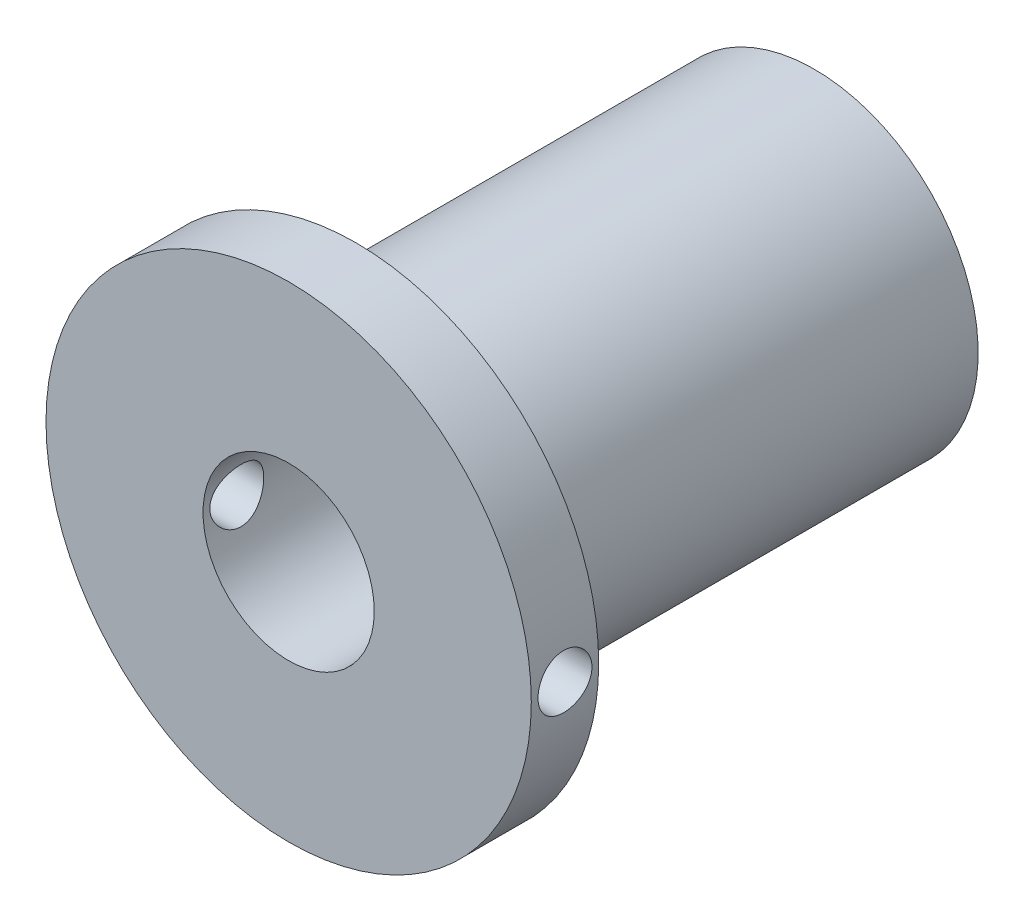
ISO-10303-21;
HEADER;
FILE_DESCRIPTION(('STEP AP214'),'2;1');
FILE_NAME('part.step','',(''),(''),'','','');
FILE_SCHEMA(('AUTOMOTIVE_DESIGN { 1 0 10303 214 1 1 1 1 }'));
ENDSEC;
DATA;
#1=APPLICATION_CONTEXT('core data for automotive mechanical design processes');
#2=APPLICATION_PROTOCOL_DEFINITION('international standard','automotive_design',2000,#1);
#3=PRODUCT_CONTEXT('',#1,'mechanical');
#4=PRODUCT('Part','Part','',(#3));
#5=PRODUCT_RELATED_PRODUCT_CATEGORY('part','',(#4));
#6=PRODUCT_DEFINITION_FORMATION('','',#4);
#7=PRODUCT_DEFINITION_CONTEXT('part definition',#1,'design');
#8=PRODUCT_DEFINITION('design','',#6,#7);
#9=PRODUCT_DEFINITION_SHAPE('','',#8);
#10=(LENGTH_UNIT() NAMED_UNIT(*) SI_UNIT(.MILLI.,.METRE.));
#11=(NAMED_UNIT(*) PLANE_ANGLE_UNIT() SI_UNIT($,.RADIAN.));
#12=(NAMED_UNIT(*) SI_UNIT($,.STERADIAN.) SOLID_ANGLE_UNIT());
#13=UNCERTAINTY_MEASURE_WITH_UNIT(LENGTH_MEASURE(1.E-05),#10,'distance_accuracy_value','');
#14=(GEOMETRIC_REPRESENTATION_CONTEXT(3) GLOBAL_UNCERTAINTY_ASSIGNED_CONTEXT((#13)) GLOBAL_UNIT_ASSIGNED_CONTEXT((#10,
#11,#12)) REPRESENTATION_CONTEXT('',''));
#15=CARTESIAN_POINT('',(0.,0.,0.));
#16=DIRECTION('',(0.,0.,1.));
#17=DIRECTION('',(1.,0.,0.));
#18=AXIS2_PLACEMENT_3D('',#15,#16,#17);
#19=CARTESIAN_POINT('',(0.,0.,-33.));
#20=DIRECTION('',(0.,0.,1.));
#21=DIRECTION('',(1.,0.,0.));
#22=AXIS2_PLACEMENT_3D('',#19,#20,#21);
#23=PLANE('',#22);
#24=CARTESIAN_POINT('',(0.,0.,-33.));
#25=DIRECTION('',(0.,0.,1.));
#26=DIRECTION('',(1.,0.,0.));
#27=AXIS2_PLACEMENT_3D('',#24,#25,#26);
#28=CIRCLE('',#27,6.35);
#29=CARTESIAN_POINT('',(6.35,0.,-33.));
#30=VERTEX_POINT('',#29);
#31=EDGE_CURVE('E12',#30,#30,#28,.T.);
#32=ORIENTED_EDGE('',*,*,#31,.T.);
#33=EDGE_LOOP('',(#32));
#34=FACE_BOUND('',#33,.T.);
#35=CARTESIAN_POINT('',(0.,0.,-33.));
#36=DIRECTION('',(0.,0.,-1.));
#37=DIRECTION('',(-1.,0.,0.));
#38=AXIS2_PLACEMENT_3D('',#35,#36,#37);
#39=CIRCLE('',#38,12.15);
#40=CARTESIAN_POINT('',(-12.15,0.,-33.));
#41=VERTEX_POINT('',#40);
#42=EDGE_CURVE('E116',#41,#41,#39,.T.);
#43=ORIENTED_EDGE('',*,*,#42,.T.);
#44=EDGE_LOOP('',(#43));
#45=FACE_BOUND('',#44,.T.);
#46=ADVANCED_FACE('F63',(#34,#45),#23,.F.);
#47=CARTESIAN_POINT('',(0.,0.,-33.));
#48=DIRECTION('',(0.,0.,1.));
#49=DIRECTION('',(1.,0.,0.));
#50=AXIS2_PLACEMENT_3D('',#47,#48,#49);
#51=CYLINDRICAL_SURFACE('',#50,18.);
#52=CARTESIAN_POINT('',(0.,0.,1.));
#53=DIRECTION('',(0.,0.,1.));
#54=DIRECTION('',(1.,0.,0.));
#55=AXIS2_PLACEMENT_3D('',#52,#53,#54);
#56=CIRCLE('',#55,18.);
#57=CARTESIAN_POINT('',(18.,0.,1.));
#58=VERTEX_POINT('',#57);
#59=EDGE_CURVE('E67',#58,#58,#56,.F.);
#60=ORIENTED_EDGE('',*,*,#59,.F.);
#61=EDGE_LOOP('',(#60));
#62=FACE_BOUND('',#61,.T.);
#63=CARTESIAN_POINT('',(0.,0.,6.));
#64=DIRECTION('',(0.,0.,1.));
#65=DIRECTION('',(1.,0.,0.));
#66=AXIS2_PLACEMENT_3D('',#63,#64,#65);
#67=CIRCLE('',#66,18.);
#68=CARTESIAN_POINT('',(18.,0.,6.));
#69=VERTEX_POINT('',#68);
#70=EDGE_CURVE('E71',#69,#69,#67,.T.);
#71=ORIENTED_EDGE('',*,*,#70,.F.);
#72=EDGE_LOOP('',(#71));
#73=FACE_BOUND('',#72,.T.);
#74=CARTESIAN_POINT('',(-18.,0.,1.5));
#75=CARTESIAN_POINT('',(-17.9999985855436,-0.111970632349519,1.50000481282726));
#76=CARTESIAN_POINT('',(-17.9989441411048,-0.22401360296951,1.50943474510488));
#77=CARTESIAN_POINT('',(-17.9948391595619,-0.444988473846702,1.54690752842418));
#78=CARTESIAN_POINT('',(-17.9917864712715,-0.553916889117786,1.57497043905084));
#79=CARTESIAN_POINT('',(-17.9840293073923,-0.765431079070291,1.64887795518216));
#80=CARTESIAN_POINT('',(-17.9793258774716,-0.868020820737628,1.6947113058597));
#81=CARTESIAN_POINT('',(-17.9687919810869,-1.06403053009986,1.80283561419854));
#82=CARTESIAN_POINT('',(-17.9629617258869,-1.1574522117349,1.86512348766916));
#83=CARTESIAN_POINT('',(-17.9507977181856,-1.33290575747026,2.00468205012817));
#84=CARTESIAN_POINT('',(-17.9444620831364,-1.4148915795421,2.08201046485678));
#85=CARTESIAN_POINT('',(-17.9320167832537,-1.56475003710051,2.2493314760365));
#86=CARTESIAN_POINT('',(-17.9259071293129,-1.63262199299226,2.33932468195854));
#87=CARTESIAN_POINT('',(-17.9145866794937,-1.7524930181623,2.52971392823023));
#88=CARTESIAN_POINT('',(-17.9093782965755,-1.80444975542339,2.63013677704985));
#89=CARTESIAN_POINT('',(-17.9004741803531,-1.89074517800796,2.83834946068707));
#90=CARTESIAN_POINT('',(-17.8967784014,-1.92508439501976,2.946139073068));
#91=CARTESIAN_POINT('',(-17.8913354423153,-1.97503194492644,3.1655519978643));
#92=CARTESIAN_POINT('',(-17.8895802517469,-1.99071729842217,3.27715757507094));
#93=CARTESIAN_POINT('',(-17.8881925066123,-2.00315006003506,3.50142986183008));
#94=CARTESIAN_POINT('',(-17.8885598839559,-1.99989807564483,3.61409653722777));
#95=CARTESIAN_POINT('',(-17.891368441014,-1.97461184427901,3.83675947497159));
#96=CARTESIAN_POINT('',(-17.8938003012309,-1.95266200172973,3.9467654566746));
#97=CARTESIAN_POINT('',(-17.9004492717341,-1.89073461157689,4.16152262538876));
#98=CARTESIAN_POINT('',(-17.904666411201,-1.85075676930152,4.26627372647657));
#99=CARTESIAN_POINT('',(-17.9144214425039,-1.75381606079451,4.46781242316311));
#100=CARTESIAN_POINT('',(-17.9199622158801,-1.6968160688148,4.56458201601582));
#101=CARTESIAN_POINT('',(-17.9317378723191,-1.56747570663675,4.74721365073087));
#102=CARTESIAN_POINT('',(-17.9379727804753,-1.49513478176794,4.83307529802335));
#103=CARTESIAN_POINT('',(-17.9504756897929,-1.33669614893956,4.99194398430861));
#104=CARTESIAN_POINT('',(-17.9567436860931,-1.25052560566827,5.06487840522475));
#105=CARTESIAN_POINT('',(-17.9685745710182,-1.06712581996098,5.19525838167234));
#106=CARTESIAN_POINT('',(-17.9741374585434,-0.969896560277035,5.25270391304576));
#107=CARTESIAN_POINT('',(-17.9839338102592,-0.767086635535504,5.35047376476476));
#108=CARTESIAN_POINT('',(-17.9881669603705,-0.661504004801704,5.39079404097506));
#109=CARTESIAN_POINT('',(-17.9948238450129,-0.445009755639361,5.45311377504167));
#110=CARTESIAN_POINT('',(-17.997247646395,-0.334098334257908,5.47511390978633));
#111=CARTESIAN_POINT('',(-18.0000041106556,-0.110723331894269,5.50007590171753));
#112=CARTESIAN_POINT('',(-18.0003477720089,0.00172892889089328,5.50313789379621));
#113=CARTESIAN_POINT('',(-17.998934812043,0.225544988687162,5.49040020748693));
#114=CARTESIAN_POINT('',(-17.9971782258895,0.336908805891321,5.47460084490708));
#115=CARTESIAN_POINT('',(-17.9917690933051,0.555095059423332,5.42467205954415));
#116=CARTESIAN_POINT('',(-17.9881214344582,0.661928438561836,5.39058988188252));
#117=CARTESIAN_POINT('',(-17.9793390034163,0.868362270126896,5.30511172227189));
#118=CARTESIAN_POINT('',(-17.9742041905801,0.967962524792293,5.25371526714896));
#119=CARTESIAN_POINT('',(-17.9629935700227,1.15755326511746,5.13482170892903));
#120=CARTESIAN_POINT('',(-17.9569139780361,1.24750253139102,5.06725923906018));
#121=CARTESIAN_POINT('',(-17.9445071585437,1.41481983480219,4.91804470166563));
#122=CARTESIAN_POINT('',(-17.938179923334,1.49218748015557,4.83639219554765));
#123=CARTESIAN_POINT('',(-17.925957484036,1.63249622432816,4.66087671093394));
#124=CARTESIAN_POINT('',(-17.920064336427,1.69537132537921,4.56696080952172));
#125=CARTESIAN_POINT('',(-17.9094097287311,1.80445556005008,4.36984371650756));
#126=CARTESIAN_POINT('',(-17.9046482500845,1.85066496700075,4.26664267722408));
#127=CARTESIAN_POINT('',(-17.8968094822665,1.92499712101143,4.05410554128338));
#128=CARTESIAN_POINT('',(-17.8937286188355,1.95315827481128,3.94478301425242));
#129=CARTESIAN_POINT('',(-17.8895891957456,1.99071877766797,3.72292485225837));
#130=CARTESIAN_POINT('',(-17.8885305631698,2.00011880320655,3.61038933329655));
#131=CARTESIAN_POINT('',(-17.8885572584665,1.99987957341679,3.38595584493495));
#132=CARTESIAN_POINT('',(-17.8896309120887,1.99034399043058,3.27405774931905));
#133=CARTESIAN_POINT('',(-17.8937762295707,1.9527225008048,3.0534642616744));
#134=CARTESIAN_POINT('',(-17.8968478949167,1.92463658036714,2.94476887202794));
#135=CARTESIAN_POINT('',(-17.9046397451111,1.85074191262564,2.73367248949078));
#136=CARTESIAN_POINT('',(-17.9093595695852,1.80493703938195,2.63127012636458));
#137=CARTESIAN_POINT('',(-17.9199166120206,1.69691508787252,2.4355895065519));
#138=CARTESIAN_POINT('',(-17.9257538322538,1.63469797623759,2.34231126841704));
#139=CARTESIAN_POINT('',(-17.9379262794022,1.49522995253707,2.16699575387357));
#140=CARTESIAN_POINT('',(-17.944263963574,1.41790170900318,2.08502016452407));
#141=CARTESIAN_POINT('',(-17.9567010614173,1.25056419248413,1.9351661277892));
#142=CARTESIAN_POINT('',(-17.962800418056,1.16055190760651,1.86729103814083));
#143=CARTESIAN_POINT('',(-17.9740935209669,0.970094486774868,1.74739566964987));
#144=CARTESIAN_POINT('',(-17.9792844558708,0.869618446416092,1.69542425026906));
#145=CARTESIAN_POINT('',(-17.9881463543356,0.66136849516123,1.60916250755517));
#146=CARTESIAN_POINT('',(-17.9918190049356,0.55360283994444,1.57485254926582));
#147=CARTESIAN_POINT('',(-17.9963232552591,0.371040239312597,1.53330083853423));
#148=CARTESIAN_POINT('',(-17.9976954860037,0.297404134861362,1.52083045156078));
#149=CARTESIAN_POINT('',(-17.9995343271896,0.149189389902707,1.50417845113601));
#150=CARTESIAN_POINT('',(-18.000000942512,0.0746107544775068,1.49999679301022));
#151=CARTESIAN_POINT('',(-18.,0.,1.5));
#152=B_SPLINE_CURVE_WITH_KNOTS('',3,(#74,#75,#76,#77,#78,#79,#80,#81,#82,#83,#84,#85,#86,#87,
#88,#89,#90,#91,#92,#93,#94,#95,#96,#97,#98,#99,#100,#101,#102,#103,#104,#105,#106,#107,#108,
#109,#110,#111,#112,#113,#114,#115,#116,#117,#118,#119,#120,#121,#122,#123,#124,#125,#126,#127,
#128,#129,#130,#131,#132,#133,#134,#135,#136,#137,#138,#139,#140,#141,#142,#143,#144,#145,#146,
#147,#148,#149,#150,#151),.UNSPECIFIED.,.T.,.F.,(4,2,2,2,2,2,2,2,2,2,2,2,2,2,2,2,2,2,2,2,2,2,2,
2,2,2,2,2,2,2,2,2,2,2,2,2,2,2,4),(0.,0.335639414270807,0.671640752838988,1.00742963320074,
1.34315561881719,1.68019649784365,2.01725360192296,2.35519959306228,2.69313538455338,
3.02967096220247,3.36619574415512,3.70120941343134,4.03622855878184,4.37198379333011,
4.70775116959619,5.0453487253329,5.3829468076176,5.72062456954608,6.05828985448105,
6.39416820670407,6.73004093517319,7.06504987759405,7.40006797606269,7.73646430887643,
8.07287111486782,8.41078088557856,8.74868511404414,9.08586787252136,9.42303847276942,
9.75836815539861,10.0936980874527,10.4289547445926,10.7642120833782,11.1012322946639,
11.4383326684529,11.7764585228658,12.1142076528796,12.3378595549845,12.5615102516508),.UNSPECIFIED.);
#153=CARTESIAN_POINT('',(-18.,0.,1.5));
#154=VERTEX_POINT('',#153);
#155=EDGE_CURVE('E80',#154,#154,#152,.T.);
#156=ORIENTED_EDGE('',*,*,#155,.F.);
#157=EDGE_LOOP('',(#156));
#158=FACE_BOUND('',#157,.T.);
#159=CARTESIAN_POINT('',(18.,0.,5.5));
#160=CARTESIAN_POINT('',(17.9999985855436,-0.111970632349519,5.49999518717274));
#161=CARTESIAN_POINT('',(17.9989441411048,-0.22401360296951,5.49056525489512));
#162=CARTESIAN_POINT('',(17.9948391595619,-0.444988473846702,5.45309247157582));
#163=CARTESIAN_POINT('',(17.9917864712715,-0.553916889117786,5.42502956094916));
#164=CARTESIAN_POINT('',(17.9840293073923,-0.765431079070291,5.35112204481784));
#165=CARTESIAN_POINT('',(17.9793258774716,-0.868020820737628,5.3052886941403));
#166=CARTESIAN_POINT('',(17.9687919810869,-1.06403053009986,5.19716438580146));
#167=CARTESIAN_POINT('',(17.9629617258869,-1.1574522117349,5.13487651233084));
#168=CARTESIAN_POINT('',(17.9507977181856,-1.33290575747026,4.99531794987183));
#169=CARTESIAN_POINT('',(17.9444620831364,-1.4148915795421,4.91798953514322));
#170=CARTESIAN_POINT('',(17.9320167832537,-1.56475003710051,4.7506685239635));
#171=CARTESIAN_POINT('',(17.9259071293129,-1.63262199299226,4.66067531804146));
#172=CARTESIAN_POINT('',(17.9145866794937,-1.7524930181623,4.47028607176977));
#173=CARTESIAN_POINT('',(17.9093782965755,-1.80444975542339,4.36986322295015));
#174=CARTESIAN_POINT('',(17.9004741803531,-1.89074517800796,4.16165053931293));
#175=CARTESIAN_POINT('',(17.8967784014,-1.92508439501976,4.053860926932));
#176=CARTESIAN_POINT('',(17.8913354423153,-1.97503194492644,3.8344480021357));
#177=CARTESIAN_POINT('',(17.8895802517469,-1.99071729842217,3.72284242492906));
#178=CARTESIAN_POINT('',(17.8881925066123,-2.00315006003506,3.49857013816992));
#179=CARTESIAN_POINT('',(17.8885598839559,-1.99989807564483,3.38590346277223));
#180=CARTESIAN_POINT('',(17.891368441014,-1.97461184427901,3.16324052502841));
#181=CARTESIAN_POINT('',(17.8938003012309,-1.95266200172973,3.0532345433254));
#182=CARTESIAN_POINT('',(17.9004492717341,-1.89073461157689,2.83847737461124));
#183=CARTESIAN_POINT('',(17.904666411201,-1.85075676930152,2.73372627352343));
#184=CARTESIAN_POINT('',(17.9144214425039,-1.75381606079451,2.53218757683689));
#185=CARTESIAN_POINT('',(17.9199622158801,-1.6968160688148,2.43541798398418));
#186=CARTESIAN_POINT('',(17.9317378723191,-1.56747570663675,2.25278634926913));
#187=CARTESIAN_POINT('',(17.9379727804753,-1.49513478176794,2.16692470197665));
#188=CARTESIAN_POINT('',(17.9504756897929,-1.33669614893956,2.00805601569139));
#189=CARTESIAN_POINT('',(17.9567436860931,-1.25052560566827,1.93512159477525));
#190=CARTESIAN_POINT('',(17.9685745710182,-1.06712581996098,1.80474161832766));
#191=CARTESIAN_POINT('',(17.9741374585434,-0.969896560277035,1.74729608695424));
#192=CARTESIAN_POINT('',(17.9839338102592,-0.767086635535504,1.64952623523524));
#193=CARTESIAN_POINT('',(17.9881669603705,-0.661504004801704,1.60920595902494));
#194=CARTESIAN_POINT('',(17.9948238450129,-0.445009755639361,1.54688622495833));
#195=CARTESIAN_POINT('',(17.997247646395,-0.334098334257908,1.52488609021367));
#196=CARTESIAN_POINT('',(18.0000041106556,-0.110723331894269,1.49992409828247));
#197=CARTESIAN_POINT('',(18.0003477720089,0.00172892889089304,1.49686210620379));
#198=CARTESIAN_POINT('',(17.998934812043,0.225544988687162,1.50959979251307));
#199=CARTESIAN_POINT('',(17.9971782258895,0.336908805891321,1.52539915509292));
#200=CARTESIAN_POINT('',(17.9917690933051,0.555095059423332,1.57532794045585));
#201=CARTESIAN_POINT('',(17.9881214344582,0.661928438561837,1.60941011811748));
#202=CARTESIAN_POINT('',(17.9793390034163,0.868362270126897,1.69488827772812));
#203=CARTESIAN_POINT('',(17.9742041905801,0.967962524792293,1.74628473285104));
#204=CARTESIAN_POINT('',(17.9629935700227,1.15755326511746,1.86517829107097));
#205=CARTESIAN_POINT('',(17.9569139780361,1.24750253139102,1.93274076093982));
#206=CARTESIAN_POINT('',(17.9445071585437,1.41481983480219,2.08195529833437));
#207=CARTESIAN_POINT('',(17.938179923334,1.49218748015557,2.16360780445234));
#208=CARTESIAN_POINT('',(17.925957484036,1.63249622432816,2.33912328906606));
#209=CARTESIAN_POINT('',(17.920064336427,1.69537132537921,2.43303919047828));
#210=CARTESIAN_POINT('',(17.9094097287311,1.80445556005008,2.63015628349244));
#211=CARTESIAN_POINT('',(17.9046482500845,1.85066496700075,2.73335732277591));
#212=CARTESIAN_POINT('',(17.8968094822665,1.92499712101143,2.94589445871662));
#213=CARTESIAN_POINT('',(17.8937286188355,1.95315827481128,3.05521698574758));
#214=CARTESIAN_POINT('',(17.8895891957456,1.99071877766797,3.27707514774163));
#215=CARTESIAN_POINT('',(17.8885305631698,2.00011880320655,3.38961066670345));
#216=CARTESIAN_POINT('',(17.8885572584665,1.99987957341679,3.61404415506505));
#217=CARTESIAN_POINT('',(17.8896309120887,1.99034399043058,3.72594225068095));
#218=CARTESIAN_POINT('',(17.8937762295707,1.9527225008048,3.94653573832561));
#219=CARTESIAN_POINT('',(17.8968478949167,1.92463658036714,4.05523112797206));
#220=CARTESIAN_POINT('',(17.9046397451111,1.85074191262564,4.26632751050922));
#221=CARTESIAN_POINT('',(17.9093595695852,1.80493703938195,4.36872987363542));
#222=CARTESIAN_POINT('',(17.9199166120206,1.69691508787252,4.5644104934481));
#223=CARTESIAN_POINT('',(17.9257538322538,1.63469797623759,4.65768873158296));
#224=CARTESIAN_POINT('',(17.9379262794022,1.49522995253707,4.83300424612643));
#225=CARTESIAN_POINT('',(17.944263963574,1.41790170900318,4.91497983547593));
#226=CARTESIAN_POINT('',(17.9567010614173,1.25056419248413,5.0648338722108));
#227=CARTESIAN_POINT('',(17.962800418056,1.16055190760651,5.13270896185917));
#228=CARTESIAN_POINT('',(17.9740935209669,0.970094486774868,5.25260433035013));
#229=CARTESIAN_POINT('',(17.9792844558708,0.869618446416091,5.30457574973094));
#230=CARTESIAN_POINT('',(17.9881463543356,0.66136849516123,5.39083749244483));
#231=CARTESIAN_POINT('',(17.9918190049356,0.55360283994444,5.42514745073418));
#232=CARTESIAN_POINT('',(17.9963232552591,0.371040239312598,5.46669916146577));
#233=CARTESIAN_POINT('',(17.9976954860037,0.297404134861362,5.47916954843922));
#234=CARTESIAN_POINT('',(17.9995343271896,0.149189389902707,5.49582154886399));
#235=CARTESIAN_POINT('',(18.000000942512,0.0746107544775069,5.50000320698978));
#236=CARTESIAN_POINT('',(18.,0.,5.5));
#237=B_SPLINE_CURVE_WITH_KNOTS('',3,(#159,#160,#161,#162,#163,#164,#165,#166,#167,#168,#169,
#170,#171,#172,#173,#174,#175,#176,#177,#178,#179,#180,#181,#182,#183,#184,#185,#186,#187,#188,
#189,#190,#191,#192,#193,#194,#195,#196,#197,#198,#199,#200,#201,#202,#203,#204,#205,#206,#207,
#208,#209,#210,#211,#212,#213,#214,#215,#216,#217,#218,#219,#220,#221,#222,#223,#224,#225,#226,
#227,#228,#229,#230,#231,#232,#233,#234,#235,#236),.UNSPECIFIED.,.T.,.F.,(4,2,2,2,2,2,2,2,2,2,2,
2,2,2,2,2,2,2,2,2,2,2,2,2,2,2,2,2,2,2,2,2,2,2,2,2,2,2,4),(0.,0.335639414270807,
0.671640752838988,1.00742963320074,1.34315561881719,1.68019649784365,2.01725360192296,
2.35519959306228,2.69313538455338,3.02967096220247,3.36619574415512,3.70120941343134,
4.03622855878184,4.37198379333011,4.70775116959619,5.0453487253329,5.3829468076176,
5.72062456954608,6.05828985448105,6.39416820670407,6.73004093517319,7.06504987759406,
7.40006797606269,7.73646430887643,8.07287111486782,8.41078088557856,8.74868511404414,
9.08586787252137,9.42303847276943,9.75836815539861,10.0936980874527,10.4289547445926,
10.7642120833782,11.1012322946639,11.4383326684529,11.7764585228658,12.1142076528796,
12.3378595549845,12.5615102516508),.UNSPECIFIED.);
#238=CARTESIAN_POINT('',(18.,0.,5.5));
#239=VERTEX_POINT('',#238);
#240=EDGE_CURVE('E89',#239,#239,#237,.T.);
#241=ORIENTED_EDGE('',*,*,#240,.F.);
#242=EDGE_LOOP('',(#241));
#243=FACE_BOUND('',#242,.T.);
#244=ADVANCED_FACE('F65',(#62,#73,#158,#243),#51,.T.);
#245=CARTESIAN_POINT('',(0.,0.,-33.));
#246=DIRECTION('',(0.,0.,1.));
#247=DIRECTION('',(1.,0.,0.));
#248=AXIS2_PLACEMENT_3D('',#245,#246,#247);
#249=CYLINDRICAL_SURFACE('',#248,6.35);
#250=ORIENTED_EDGE('',*,*,#31,.F.);
#251=EDGE_LOOP('',(#250));
#252=FACE_BOUND('',#251,.T.);
#253=CARTESIAN_POINT('',(0.,0.,6.));
#254=DIRECTION('',(0.,0.,1.));
#255=DIRECTION('',(1.,0.,0.));
#256=AXIS2_PLACEMENT_3D('',#253,#254,#255);
#257=CIRCLE('',#256,6.35);
#258=CARTESIAN_POINT('',(6.35,0.,6.));
#259=VERTEX_POINT('',#258);
#260=EDGE_CURVE('E75',#259,#259,#257,.T.);
#261=ORIENTED_EDGE('',*,*,#260,.T.);
#262=EDGE_LOOP('',(#261));
#263=FACE_BOUND('',#262,.T.);
#264=CARTESIAN_POINT('',(-6.35,0.,1.5));
#265=CARTESIAN_POINT('',(-6.34999954177388,-0.109459382542907,1.50000058354949));
#266=CARTESIAN_POINT('',(-6.34714311321166,-0.218925049959982,1.50901558710158));
#267=CARTESIAN_POINT('',(-6.33602827356407,-0.434652473788955,1.5447410824913));
#268=CARTESIAN_POINT('',(-6.32776871709148,-0.540913545874182,1.57145532633459));
#269=CARTESIAN_POINT('',(-6.30674936557198,-0.747089875657803,1.64158716072899));
#270=CARTESIAN_POINT('',(-6.2939966038065,-0.847014764673544,1.6849786557192));
#271=CARTESIAN_POINT('',(-6.26530583445687,-1.03817017833074,1.787121440277));
#272=CARTESIAN_POINT('',(-6.24936730983397,-1.12939928812193,1.84587522357063));
#273=CARTESIAN_POINT('',(-6.21543683798116,-1.30343118018697,1.97901136120565));
#274=CARTESIAN_POINT('',(-6.19739963027479,-1.38592345094522,2.05378802635612));
#275=CARTESIAN_POINT('',(-6.16156531174633,-1.53742831833673,2.21600787243298));
#276=CARTESIAN_POINT('',(-6.14376824711775,-1.60643835501439,2.30345345340626));
#277=CARTESIAN_POINT('',(-6.10994220236164,-1.73071363408787,2.49122929376167));
#278=CARTESIAN_POINT('',(-6.09396900491067,-1.78558916761595,2.59182847722825));
#279=CARTESIAN_POINT('',(-6.06628083683232,-1.87751386092633,2.80141198660405));
#280=CARTESIAN_POINT('',(-6.05456472452069,-1.91456780104787,2.91039405483927));
#281=CARTESIAN_POINT('',(-6.03719105635796,-1.96865797245166,3.13014256754477));
#282=CARTESIAN_POINT('',(-6.03135942687503,-1.98627089440143,3.24075291341509));
#283=CARTESIAN_POINT('',(-6.02589838737814,-2.00278087222624,3.46350056160201));
#284=CARTESIAN_POINT('',(-6.02626729850521,-2.00168299423813,3.5756374423777));
#285=CARTESIAN_POINT('',(-6.03301213155008,-1.98125320609646,3.79346796254297));
#286=CARTESIAN_POINT('',(-6.03914580837347,-1.96265658538293,3.89923933126119));
#287=CARTESIAN_POINT('',(-6.05633519979143,-1.90895021373769,4.10607693428555));
#288=CARTESIAN_POINT('',(-6.06739144503234,-1.8738386824976,4.2071426600319));
#289=CARTESIAN_POINT('',(-6.0933643515369,-1.78758434079555,4.40344233081236));
#290=CARTESIAN_POINT('',(-6.10833567795451,-1.73621215869284,4.49856794601275));
#291=CARTESIAN_POINT('',(-6.14042705773518,-1.6190540664784,4.67908872150141));
#292=CARTESIAN_POINT('',(-6.15754767614423,-1.55326436261562,4.76448131168549));
#293=CARTESIAN_POINT('',(-6.19297824394465,-1.40553948054554,4.92726612322606));
#294=CARTESIAN_POINT('',(-6.2113065642987,-1.32299795804768,5.0041051229237));
#295=CARTESIAN_POINT('',(-6.24638917019528,-1.14597287727256,5.14298607600785));
#296=CARTESIAN_POINT('',(-6.26314333535266,-1.05148840693984,5.20502689824582));
#297=CARTESIAN_POINT('',(-6.29337063173254,-0.852181054275976,5.31293320937956));
#298=CARTESIAN_POINT('',(-6.30681635072294,-0.747281283701515,5.35866488145911));
#299=CARTESIAN_POINT('',(-6.32871380255594,-0.530755398571079,5.43166785389612));
#300=CARTESIAN_POINT('',(-6.33716707666898,-0.419131371671137,5.4589448519701));
#301=CARTESIAN_POINT('',(-6.34787832908592,-0.197020017835356,5.49331746782127));
#302=CARTESIAN_POINT('',(-6.35036604099747,-0.0866594761204059,5.5011618491616));
#303=CARTESIAN_POINT('',(-6.34954641773507,0.133813926362039,5.49856019855348));
#304=CARTESIAN_POINT('',(-6.34623994398884,0.243926821510504,5.48811688545606));
#305=CARTESIAN_POINT('',(-6.33435451969435,0.457878637788791,5.44983646146118));
#306=CARTESIAN_POINT('',(-6.325911202165,0.561805824109795,5.42244650327112));
#307=CARTESIAN_POINT('',(-6.30474229444981,0.763559126456238,5.35159744836663));
#308=CARTESIAN_POINT('',(-6.29201617296049,0.861384483733321,5.30813635788091));
#309=CARTESIAN_POINT('',(-6.26319856305455,1.05083641206033,5.20518375229588));
#310=CARTESIAN_POINT('',(-6.24703194034033,1.14225110153446,5.14532394819846));
#311=CARTESIAN_POINT('',(-6.21318025142311,1.31398832981217,5.01171388169452));
#312=CARTESIAN_POINT('',(-6.19549476796846,1.394307804701,4.93795979565597));
#313=CARTESIAN_POINT('',(-6.15970098041184,1.54493496266177,4.77513269683127));
#314=CARTESIAN_POINT('',(-6.1416043516294,1.61470885314466,4.68556218774911));
#315=CARTESIAN_POINT('',(-6.10778048462924,1.73828550034023,4.49559091681831));
#316=CARTESIAN_POINT('',(-6.09205321442616,1.79208847266324,4.39519030120304));
#317=CARTESIAN_POINT('',(-6.06492137157673,1.88186972548412,4.18659077566598));
#318=CARTESIAN_POINT('',(-6.05350088491069,1.91791378151849,4.07842236888353));
#319=CARTESIAN_POINT('',(-6.03638058511952,1.97114343438127,3.85711703695491));
#320=CARTESIAN_POINT('',(-6.03067855056365,1.98833635449891,3.74398205899937));
#321=CARTESIAN_POINT('',(-6.02587471885277,2.00284439370545,3.52154245016702));
#322=CARTESIAN_POINT('',(-6.02648176413455,2.00103634345504,3.41230059749889));
#323=CARTESIAN_POINT('',(-6.03351893966243,1.97971522185172,3.19575938742112));
#324=CARTESIAN_POINT('',(-6.03994879016139,1.96020300106662,3.08845993694455));
#325=CARTESIAN_POINT('',(-6.05770205715241,1.90461841343822,2.88044456027371));
#326=CARTESIAN_POINT('',(-6.06895005951139,1.86880073990096,2.77965365194179));
#327=CARTESIAN_POINT('',(-6.0950519726527,1.78182311987174,2.58543184362183));
#328=CARTESIAN_POINT('',(-6.10990662507357,1.7306600173762,2.49200246263139));
#329=CARTESIAN_POINT('',(-6.14228296482453,1.61207166769779,2.31114466448104));
#330=CARTESIAN_POINT('',(-6.15988705347009,1.54408200610561,2.224101128443));
#331=CARTESIAN_POINT('',(-6.19540382399595,1.39475914789555,2.06237483925015));
#332=CARTESIAN_POINT('',(-6.21331658777418,1.31342235965995,1.98769542408948));
#333=CARTESIAN_POINT('',(-6.24814930497826,1.13645022907771,1.85032141081745));
#334=CARTESIAN_POINT('',(-6.26501620684602,1.04042842012035,1.78810970882047));
#335=CARTESIAN_POINT('',(-6.29518499838427,0.8387590923247,1.6807921190618));
#336=CARTESIAN_POINT('',(-6.30848823421976,0.733115228456039,1.63567976938718));
#337=CARTESIAN_POINT('',(-6.32915110555605,0.523924084589954,1.56696118897334));
#338=CARTESIAN_POINT('',(-6.33690087757196,0.42088438096241,1.54192397723383));
#339=CARTESIAN_POINT('',(-6.34732501355995,0.211898004201452,1.50844484312058));
#340=CARTESIAN_POINT('',(-6.35000044354306,0.105951946376475,1.49999943514934));
#341=CARTESIAN_POINT('',(-6.35,0.,1.5));
#342=B_SPLINE_CURVE_WITH_KNOTS('',3,(#264,#265,#266,#267,#268,#269,#270,#271,#272,#273,#274,
#275,#276,#277,#278,#279,#280,#281,#282,#283,#284,#285,#286,#287,#288,#289,#290,#291,#292,#293,
#294,#295,#296,#297,#298,#299,#300,#301,#302,#303,#304,#305,#306,#307,#308,#309,#310,#311,#312,
#313,#314,#315,#316,#317,#318,#319,#320,#321,#322,#323,#324,#325,#326,#327,#328,#329,#330,#331,
#332,#333,#334,#335,#336,#337,#338,#339,#340,#341),.UNSPECIFIED.,.T.,.F.,(4,2,2,2,2,2,2,2,2,2,2,
2,2,2,2,2,2,2,2,2,2,2,2,2,2,2,2,2,2,2,2,2,2,2,2,2,2,2,4),(0.,0.327988650558007,
0.656046852642941,0.983593805173076,1.31119396071542,1.6480406473964,1.98495123122211,
2.33034249119075,2.67564105409013,3.01039595432063,3.34506021774285,3.66626171481526,
3.98749784536771,4.31348397544876,4.63955598702786,4.9807199943601,5.32191007136131,
5.66583848283943,6.00966066096294,6.34001323425943,6.67031669785623,6.99225602053112,
7.31423529613717,7.64414085870835,7.97413734250024,8.31743010871831,8.6607182402099,
9.00272515843012,9.34459916667784,9.67076879349641,9.99692275086076,10.3181482438305,
10.6394398466999,10.9734721104888,11.3075944078494,11.6528624869261,11.9979999574323,
12.3155454971876,12.6330243200048),.UNSPECIFIED.);
#343=CARTESIAN_POINT('',(-6.35,0.,1.5));
#344=VERTEX_POINT('',#343);
#345=EDGE_CURVE('E81',#344,#344,#342,.T.);
#346=ORIENTED_EDGE('',*,*,#345,.T.);
#347=EDGE_LOOP('',(#346));
#348=FACE_BOUND('',#347,.T.);
#349=CARTESIAN_POINT('',(6.35,0.,5.5));
#350=CARTESIAN_POINT('',(6.34999954177388,-0.109459382542907,5.49999941645051));
#351=CARTESIAN_POINT('',(6.34714311321166,-0.218925049959982,5.49098441289842));
#352=CARTESIAN_POINT('',(6.33602827356407,-0.434652473788955,5.4552589175087));
#353=CARTESIAN_POINT('',(6.32776871709148,-0.540913545874182,5.42854467366541));
#354=CARTESIAN_POINT('',(6.30674936557198,-0.747089875657802,5.35841283927101));
#355=CARTESIAN_POINT('',(6.2939966038065,-0.847014764673543,5.3150213442808));
#356=CARTESIAN_POINT('',(6.26530583445687,-1.03817017833074,5.212878559723));
#357=CARTESIAN_POINT('',(6.24936730983396,-1.12939928812193,5.15412477642937));
#358=CARTESIAN_POINT('',(6.21543683798116,-1.30343118018697,5.02098863879435));
#359=CARTESIAN_POINT('',(6.19739963027479,-1.38592345094522,4.94621197364388));
#360=CARTESIAN_POINT('',(6.16156531174633,-1.53742831833673,4.78399212756702));
#361=CARTESIAN_POINT('',(6.14376824711775,-1.60643835501439,4.69654654659375));
#362=CARTESIAN_POINT('',(6.10994220236164,-1.73071363408787,4.50877070623833));
#363=CARTESIAN_POINT('',(6.09396900491067,-1.78558916761594,4.40817152277175));
#364=CARTESIAN_POINT('',(6.06628083683232,-1.87751386092633,4.19858801339595));
#365=CARTESIAN_POINT('',(6.05456472452069,-1.91456780104787,4.08960594516073));
#366=CARTESIAN_POINT('',(6.03719105635797,-1.96865797245166,3.86985743245523));
#367=CARTESIAN_POINT('',(6.03135942687504,-1.98627089440143,3.75924708658491));
#368=CARTESIAN_POINT('',(6.02589838737814,-2.00278087222624,3.53649943839799));
#369=CARTESIAN_POINT('',(6.02626729850521,-2.00168299423813,3.4243625576223));
#370=CARTESIAN_POINT('',(6.03301213155008,-1.98125320609646,3.20653203745703));
#371=CARTESIAN_POINT('',(6.03914580837347,-1.96265658538293,3.10076066873881));
#372=CARTESIAN_POINT('',(6.05633519979143,-1.90895021373769,2.89392306571445));
#373=CARTESIAN_POINT('',(6.06739144503234,-1.8738386824976,2.7928573399681));
#374=CARTESIAN_POINT('',(6.0933643515369,-1.78758434079555,2.59655766918765));
#375=CARTESIAN_POINT('',(6.10833567795451,-1.73621215869284,2.50143205398726));
#376=CARTESIAN_POINT('',(6.14042705773518,-1.6190540664784,2.32091127849859));
#377=CARTESIAN_POINT('',(6.15754767614423,-1.55326436261562,2.23551868831451));
#378=CARTESIAN_POINT('',(6.19297824394465,-1.40553948054554,2.07273387677394));
#379=CARTESIAN_POINT('',(6.2113065642987,-1.32299795804768,1.9958948770763));
#380=CARTESIAN_POINT('',(6.24638917019528,-1.14597287727256,1.85701392399215));
#381=CARTESIAN_POINT('',(6.26314333535266,-1.05148840693984,1.79497310175418));
#382=CARTESIAN_POINT('',(6.29337063173254,-0.852181054275977,1.68706679062044));
#383=CARTESIAN_POINT('',(6.30681635072294,-0.747281283701516,1.64133511854089));
#384=CARTESIAN_POINT('',(6.32871380255594,-0.53075539857108,1.56833214610388));
#385=CARTESIAN_POINT('',(6.33716707666898,-0.419131371671139,1.5410551480299));
#386=CARTESIAN_POINT('',(6.34787832908592,-0.197020017835357,1.50668253217873));
#387=CARTESIAN_POINT('',(6.35036604099747,-0.0866594761204073,1.4988381508384));
#388=CARTESIAN_POINT('',(6.34954641773507,0.133813926362037,1.50143980144652));
#389=CARTESIAN_POINT('',(6.34623994398884,0.243926821510502,1.51188311454394));
#390=CARTESIAN_POINT('',(6.33435451969435,0.45787863778879,1.55016353853882));
#391=CARTESIAN_POINT('',(6.325911202165,0.561805824109793,1.57755349672888));
#392=CARTESIAN_POINT('',(6.30474229444981,0.763559126456237,1.64840255163337));
#393=CARTESIAN_POINT('',(6.29201617296049,0.86138448373332,1.69186364211909));
#394=CARTESIAN_POINT('',(6.26319856305455,1.05083641206033,1.79481624770412));
#395=CARTESIAN_POINT('',(6.24703194034033,1.14225110153446,1.85467605180154));
#396=CARTESIAN_POINT('',(6.21318025142311,1.31398832981217,1.98828611830548));
#397=CARTESIAN_POINT('',(6.19549476796846,1.394307804701,2.06204020434403));
#398=CARTESIAN_POINT('',(6.15970098041184,1.54493496266177,2.22486730316873));
#399=CARTESIAN_POINT('',(6.1416043516294,1.61470885314466,2.31443781225088));
#400=CARTESIAN_POINT('',(6.10778048462924,1.73828550034023,2.50440908318169));
#401=CARTESIAN_POINT('',(6.09205321442616,1.79208847266323,2.60480969879696));
#402=CARTESIAN_POINT('',(6.06492137157673,1.88186972548412,2.81340922433402));
#403=CARTESIAN_POINT('',(6.05350088491069,1.91791378151849,2.92157763111646));
#404=CARTESIAN_POINT('',(6.03638058511952,1.97114343438127,3.14288296304509));
#405=CARTESIAN_POINT('',(6.03067855056365,1.98833635449891,3.25601794100063));
#406=CARTESIAN_POINT('',(6.02587471885277,2.00284439370545,3.47845754983298));
#407=CARTESIAN_POINT('',(6.02648176413455,2.00103634345504,3.58769940250111));
#408=CARTESIAN_POINT('',(6.03351893966243,1.97971522185172,3.80424061257888));
#409=CARTESIAN_POINT('',(6.03994879016139,1.96020300106662,3.91154006305545));
#410=CARTESIAN_POINT('',(6.05770205715241,1.90461841343822,4.11955543972629));
#411=CARTESIAN_POINT('',(6.06895005951139,1.86880073990096,4.22034634805821));
#412=CARTESIAN_POINT('',(6.0950519726527,1.78182311987174,4.41456815637817));
#413=CARTESIAN_POINT('',(6.10990662507357,1.7306600173762,4.50799753736861));
#414=CARTESIAN_POINT('',(6.14228296482453,1.61207166769779,4.68885533551896));
#415=CARTESIAN_POINT('',(6.15988705347009,1.54408200610561,4.775898871557));
#416=CARTESIAN_POINT('',(6.19540382399595,1.39475914789555,4.93762516074985));
#417=CARTESIAN_POINT('',(6.21331658777418,1.31342235965995,5.01230457591052));
#418=CARTESIAN_POINT('',(6.24814930497826,1.13645022907771,5.14967858918255));
#419=CARTESIAN_POINT('',(6.26501620684602,1.04042842012035,5.21189029117953));
#420=CARTESIAN_POINT('',(6.29518499838427,0.838759092324701,5.3192078809382));
#421=CARTESIAN_POINT('',(6.30848823421976,0.73311522845604,5.36432023061282));
#422=CARTESIAN_POINT('',(6.32915110555605,0.523924084589956,5.43303881102666));
#423=CARTESIAN_POINT('',(6.33690087757196,0.420884380962411,5.45807602276617));
#424=CARTESIAN_POINT('',(6.34732501355995,0.211898004201453,5.49155515687942));
#425=CARTESIAN_POINT('',(6.35000044354306,0.105951946376475,5.50000056485066));
#426=CARTESIAN_POINT('',(6.35,0.,5.5));
#427=B_SPLINE_CURVE_WITH_KNOTS('',3,(#349,#350,#351,#352,#353,#354,#355,#356,#357,#358,#359,
#360,#361,#362,#363,#364,#365,#366,#367,#368,#369,#370,#371,#372,#373,#374,#375,#376,#377,#378,
#379,#380,#381,#382,#383,#384,#385,#386,#387,#388,#389,#390,#391,#392,#393,#394,#395,#396,#397,
#398,#399,#400,#401,#402,#403,#404,#405,#406,#407,#408,#409,#410,#411,#412,#413,#414,#415,#416,
#417,#418,#419,#420,#421,#422,#423,#424,#425,#426),.UNSPECIFIED.,.T.,.F.,(4,2,2,2,2,2,2,2,2,2,2,
2,2,2,2,2,2,2,2,2,2,2,2,2,2,2,2,2,2,2,2,2,2,2,2,2,2,2,4),(0.,0.327988650558007,
0.656046852642941,0.983593805173074,1.31119396071542,1.6480406473964,1.98495123122211,
2.33034249119075,2.67564105409013,3.01039595432063,3.34506021774285,3.66626171481525,
3.98749784536771,4.31348397544876,4.63955598702785,4.98071999436009,5.3219100713613,
5.66583848283943,6.00966066096294,6.34001323425943,6.67031669785622,6.99225602053112,
7.31423529613717,7.64414085870835,7.97413734250023,8.31743010871831,8.66071824020989,
9.00272515843011,9.34459916667783,9.6707687934964,9.99692275086076,10.3181482438305,
10.6394398466999,10.9734721104888,11.3075944078494,11.6528624869261,11.9979999574323,
12.3155454971876,12.6330243200048),.UNSPECIFIED.);
#428=CARTESIAN_POINT('',(6.35,0.,5.5));
#429=VERTEX_POINT('',#428);
#430=EDGE_CURVE('E123',#429,#429,#427,.T.);
#431=ORIENTED_EDGE('',*,*,#430,.T.);
#432=EDGE_LOOP('',(#431));
#433=FACE_BOUND('',#432,.T.);
#434=ADVANCED_FACE('F104',(#252,#263,#348,#433),#249,.F.);
#435=CARTESIAN_POINT('',(0.,0.,6.));
#436=DIRECTION('',(0.,0.,1.));
#437=DIRECTION('',(1.,0.,0.));
#438=AXIS2_PLACEMENT_3D('',#435,#436,#437);
#439=PLANE('',#438);
#440=ORIENTED_EDGE('',*,*,#70,.T.);
#441=EDGE_LOOP('',(#440));
#442=FACE_BOUND('',#441,.T.);
#443=ORIENTED_EDGE('',*,*,#260,.F.);
#444=EDGE_LOOP('',(#443));
#445=FACE_BOUND('',#444,.T.);
#446=ADVANCED_FACE('F101',(#442,#445),#439,.T.);
#447=CARTESIAN_POINT('',(-18.,0.,3.5));
#448=DIRECTION('',(1.,0.,0.));
#449=DIRECTION('',(0.,0.,-1.));
#450=AXIS2_PLACEMENT_3D('',#447,#448,#449);
#451=CYLINDRICAL_SURFACE('',#450,2.);
#452=ORIENTED_EDGE('',*,*,#155,.T.);
#453=EDGE_LOOP('',(#452));
#454=FACE_BOUND('',#453,.T.);
#455=ORIENTED_EDGE('',*,*,#345,.F.);
#456=EDGE_LOOP('',(#455));
#457=FACE_BOUND('',#456,.T.);
#458=ADVANCED_FACE('F95',(#454,#457),#451,.F.);
#459=CARTESIAN_POINT('',(18.,0.,3.5));
#460=DIRECTION('',(-1.,0.,0.));
#461=DIRECTION('',(0.,0.,1.));
#462=AXIS2_PLACEMENT_3D('',#459,#460,#461);
#463=CYLINDRICAL_SURFACE('',#462,2.);
#464=ORIENTED_EDGE('',*,*,#240,.T.);
#465=EDGE_LOOP('',(#464));
#466=FACE_BOUND('',#465,.T.);
#467=ORIENTED_EDGE('',*,*,#430,.F.);
#468=EDGE_LOOP('',(#467));
#469=FACE_BOUND('',#468,.T.);
#470=ADVANCED_FACE('F133',(#466,#469),#463,.F.);
#471=CARTESIAN_POINT('',(0.,0.,59.3655043609174));
#472=DIRECTION('',(0.,0.,-1.));
#473=DIRECTION('',(-1.,0.,0.));
#474=AXIS2_PLACEMENT_3D('',#471,#472,#473);
#475=CYLINDRICAL_SURFACE('',#474,12.15);
#476=ORIENTED_EDGE('',*,*,#42,.F.);
#477=EDGE_LOOP('',(#476));
#478=FACE_BOUND('',#477,.T.);
#479=CARTESIAN_POINT('',(0.,0.,1.));
#480=DIRECTION('',(0.,0.,1.));
#481=DIRECTION('',(1.,0.,0.));
#482=AXIS2_PLACEMENT_3D('',#479,#480,#481);
#483=CIRCLE('',#482,12.15);
#484=CARTESIAN_POINT('',(12.15,0.,1.));
#485=VERTEX_POINT('',#484);
#486=EDGE_CURVE('E118',#485,#485,#483,.F.);
#487=ORIENTED_EDGE('',*,*,#486,.T.);
#488=EDGE_LOOP('',(#487));
#489=FACE_BOUND('',#488,.T.);
#490=ADVANCED_FACE('F141',(#478,#489),#475,.T.);
#491=CARTESIAN_POINT('',(0.,0.,1.));
#492=DIRECTION('',(0.,0.,1.));
#493=DIRECTION('',(1.,0.,0.));
#494=AXIS2_PLACEMENT_3D('',#491,#492,#493);
#495=PLANE('',#494);
#496=ORIENTED_EDGE('',*,*,#59,.T.);
#497=EDGE_LOOP('',(#496));
#498=FACE_BOUND('',#497,.T.);
#499=ORIENTED_EDGE('',*,*,#486,.F.);
#500=EDGE_LOOP('',(#499));
#501=FACE_BOUND('',#500,.T.);
#502=ADVANCED_FACE('F137',(#498,#501),#495,.F.);
#503=CLOSED_SHELL('',(#46,#244,#434,#446,#458,#470,#490,#502));
#504=MANIFOLD_SOLID_BREP('B2',#503);
#505=ADVANCED_BREP_SHAPE_REPRESENTATION('',(#18,#504),#14);
#506=SHAPE_DEFINITION_REPRESENTATION(#9,#505);
ENDSEC;
END-ISO-10303-21;
